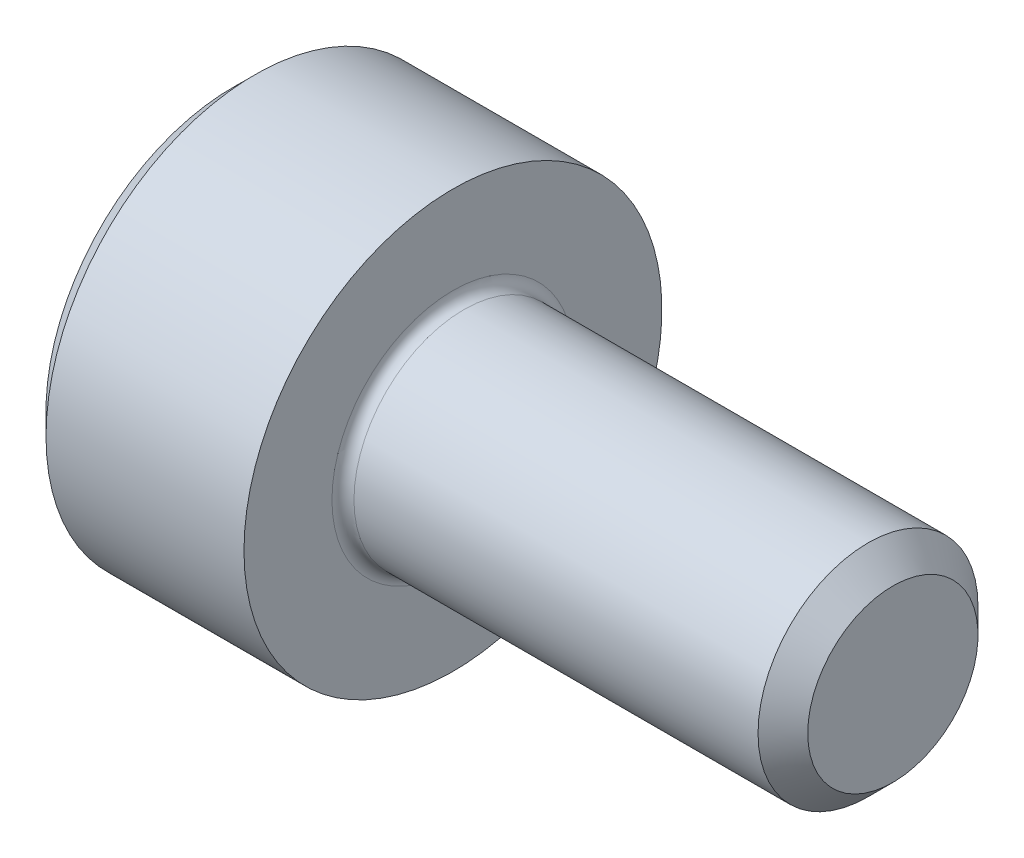
ISO-10303-21;
HEADER;
FILE_DESCRIPTION(('STEP AP214'),'2;1');
FILE_NAME('part.step','',(''),(''),'','','');
FILE_SCHEMA(('AUTOMOTIVE_DESIGN { 1 0 10303 214 1 1 1 1 }'));
ENDSEC;
DATA;
#1=APPLICATION_CONTEXT('core data for automotive mechanical design processes');
#2=APPLICATION_PROTOCOL_DEFINITION('international standard','automotive_design',2000,#1);
#3=PRODUCT_CONTEXT('',#1,'mechanical');
#4=PRODUCT('Part','Part','',(#3));
#5=PRODUCT_RELATED_PRODUCT_CATEGORY('part','',(#4));
#6=PRODUCT_DEFINITION_FORMATION('','',#4);
#7=PRODUCT_DEFINITION_CONTEXT('part definition',#1,'design');
#8=PRODUCT_DEFINITION('design','',#6,#7);
#9=PRODUCT_DEFINITION_SHAPE('','',#8);
#10=(LENGTH_UNIT() NAMED_UNIT(*) SI_UNIT(.MILLI.,.METRE.));
#11=(NAMED_UNIT(*) PLANE_ANGLE_UNIT() SI_UNIT($,.RADIAN.));
#12=(NAMED_UNIT(*) SI_UNIT($,.STERADIAN.) SOLID_ANGLE_UNIT());
#13=UNCERTAINTY_MEASURE_WITH_UNIT(LENGTH_MEASURE(1.E-05),#10,'distance_accuracy_value','');
#14=(GEOMETRIC_REPRESENTATION_CONTEXT(3) GLOBAL_UNCERTAINTY_ASSIGNED_CONTEXT((#13)) GLOBAL_UNIT_ASSIGNED_CONTEXT((#10,
#11,#12)) REPRESENTATION_CONTEXT('',''));
#15=CARTESIAN_POINT('',(0.,0.,0.));
#16=DIRECTION('',(0.,0.,1.));
#17=DIRECTION('',(1.,0.,0.));
#18=AXIS2_PLACEMENT_3D('',#15,#16,#17);
#19=CARTESIAN_POINT('',(0.999999999976353,0.,0.));
#20=DIRECTION('',(-1.,0.,0.));
#21=DIRECTION('',(0.,0.,1.));
#22=AXIS2_PLACEMENT_3D('',#19,#20,#21);
#23=CONICAL_SURFACE('',#22,0.772500000039145,1.04719755119766);
#24=CARTESIAN_POINT('',(1.44600308291842,0.,2.8421709430404E-11));
#25=VERTEX_POINT('',#24);
#26=VERTEX_LOOP('',#25);
#27=FACE_BOUND('',#26,.T.);
#28=CARTESIAN_POINT('',(0.999999999976353,0.,0.));
#29=DIRECTION('',(-1.,0.,0.));
#30=DIRECTION('',(0.,0.,1.));
#31=AXIS2_PLACEMENT_3D('',#28,#29,#30);
#32=CIRCLE('',#31,0.772500000039145);
#33=CARTESIAN_POINT('',(0.999999999988177,-0.669004624440429,0.386250000009787));
#34=VERTEX_POINT('',#33);
#35=CARTESIAN_POINT('',(0.999999999988177,0.,0.772500000019571));
#36=VERTEX_POINT('',#35);
#37=EDGE_CURVE('E96',#34,#36,#32,.T.);
#38=ORIENTED_EDGE('',*,*,#37,.T.);
#39=CARTESIAN_POINT('',(0.999999999976353,0.,0.));
#40=DIRECTION('',(-1.,0.,0.));
#41=DIRECTION('',(0.,0.,1.));
#42=AXIS2_PLACEMENT_3D('',#39,#40,#41);
#43=CIRCLE('',#42,0.772500000039145);
#44=CARTESIAN_POINT('',(0.999999999988177,0.669004624440428,0.386250000009784));
#45=VERTEX_POINT('',#44);
#46=EDGE_CURVE('E99',#36,#45,#43,.T.);
#47=ORIENTED_EDGE('',*,*,#46,.T.);
#48=CARTESIAN_POINT('',(0.999999999976353,0.,0.));
#49=DIRECTION('',(-1.,0.,0.));
#50=DIRECTION('',(0.,0.,1.));
#51=AXIS2_PLACEMENT_3D('',#48,#49,#50);
#52=CIRCLE('',#51,0.772500000039145);
#53=CARTESIAN_POINT('',(0.999999999988177,0.669004624440428,-0.386250000009787));
#54=VERTEX_POINT('',#53);
#55=EDGE_CURVE('E101',#45,#54,#52,.T.);
#56=ORIENTED_EDGE('',*,*,#55,.T.);
#57=CARTESIAN_POINT('',(0.999999999976353,0.,0.));
#58=DIRECTION('',(-1.,0.,0.));
#59=DIRECTION('',(0.,0.,1.));
#60=AXIS2_PLACEMENT_3D('',#57,#58,#59);
#61=CIRCLE('',#60,0.772500000039145);
#62=CARTESIAN_POINT('',(0.999999999988177,0.,-0.772500000019573));
#63=VERTEX_POINT('',#62);
#64=EDGE_CURVE('E115',#54,#63,#61,.T.);
#65=ORIENTED_EDGE('',*,*,#64,.T.);
#66=CARTESIAN_POINT('',(0.999999999976353,0.,0.));
#67=DIRECTION('',(-1.,0.,0.));
#68=DIRECTION('',(0.,0.,1.));
#69=AXIS2_PLACEMENT_3D('',#66,#67,#68);
#70=CIRCLE('',#69,0.772500000039145);
#71=CARTESIAN_POINT('',(0.999999999988177,-0.669004624440431,-0.386250000009786));
#72=VERTEX_POINT('',#71);
#73=EDGE_CURVE('E116',#63,#72,#70,.T.);
#74=ORIENTED_EDGE('',*,*,#73,.T.);
#75=CARTESIAN_POINT('',(0.999999999976353,0.,0.));
#76=DIRECTION('',(-1.,0.,0.));
#77=DIRECTION('',(0.,0.,1.));
#78=AXIS2_PLACEMENT_3D('',#75,#76,#77);
#79=CIRCLE('',#78,0.772500000039145);
#80=EDGE_CURVE('E226',#72,#34,#79,.T.);
#81=ORIENTED_EDGE('',*,*,#80,.T.);
#82=EDGE_LOOP('',(#38,#47,#56,#65,#74,#81));
#83=FACE_BOUND('',#82,.T.);
#84=ADVANCED_FACE('F17',(#27,#83),#23,.F.);
#85=CARTESIAN_POINT('',(1.,1.33800924884695,-0.772500000000004));
#86=DIRECTION('',(1.,0.,0.));
#87=DIRECTION('',(0.,0.,-1.));
#88=AXIS2_PLACEMENT_3D('',#85,#86,#87);
#89=PLANE('',#88);
#90=DIRECTION('',(0.,0.499999999999999,-0.866025403784439));
#91=VECTOR('',#90,1.);
#92=CARTESIAN_POINT('',(1.,0.892006165897968,0.));
#93=LINE('',#92,#91);
#94=CARTESIAN_POINT('',(1.,0.446003082948984,0.772499999999998));
#95=VERTEX_POINT('',#94);
#96=EDGE_CURVE('E119',#45,#95,#93,.F.);
#97=ORIENTED_EDGE('',*,*,#96,.F.);
#98=ORIENTED_EDGE('',*,*,#46,.F.);
#99=DIRECTION('',(0.,-1.,0.));
#100=VECTOR('',#99,1.);
#101=CARTESIAN_POINT('',(1.,-0.446003082948988,0.772499999999999));
#102=LINE('',#101,#100);
#103=EDGE_CURVE('E121',#36,#95,#102,.F.);
#104=ORIENTED_EDGE('',*,*,#103,.T.);
#105=EDGE_LOOP('',(#97,#98,#104));
#106=FACE_BOUND('',#105,.T.);
#107=ADVANCED_FACE('F120',(#106),#89,.F.);
#108=CARTESIAN_POINT('',(1.,1.33800924884695,-0.772500000000004));
#109=DIRECTION('',(1.,0.,0.));
#110=DIRECTION('',(0.,0.,-1.));
#111=AXIS2_PLACEMENT_3D('',#108,#109,#110);
#112=PLANE('',#111);
#113=DIRECTION('',(0.,-1.,0.));
#114=VECTOR('',#113,1.);
#115=CARTESIAN_POINT('',(1.,-0.446003082948988,0.772499999999999));
#116=LINE('',#115,#114);
#117=CARTESIAN_POINT('',(1.,-0.446003082948988,0.772499999999999));
#118=VERTEX_POINT('',#117);
#119=EDGE_CURVE('E124',#118,#36,#116,.F.);
#120=ORIENTED_EDGE('',*,*,#119,.T.);
#121=ORIENTED_EDGE('',*,*,#37,.F.);
#122=DIRECTION('',(0.,0.500000000000001,0.866025403784438));
#123=VECTOR('',#122,1.);
#124=CARTESIAN_POINT('',(1.,-0.446003082948988,0.772499999999999));
#125=LINE('',#124,#123);
#126=EDGE_CURVE('E177',#118,#34,#125,.F.);
#127=ORIENTED_EDGE('',*,*,#126,.F.);
#128=EDGE_LOOP('',(#120,#121,#127));
#129=FACE_BOUND('',#128,.T.);
#130=ADVANCED_FACE('F346',(#129),#112,.F.);
#131=CARTESIAN_POINT('',(1.,1.33800924884695,-0.772500000000004));
#132=DIRECTION('',(1.,0.,0.));
#133=DIRECTION('',(0.,0.,-1.));
#134=AXIS2_PLACEMENT_3D('',#131,#132,#133);
#135=PLANE('',#134);
#136=DIRECTION('',(0.,0.500000000000001,0.866025403784438));
#137=VECTOR('',#136,1.);
#138=CARTESIAN_POINT('',(1.,-0.446003082948988,0.772499999999999));
#139=LINE('',#138,#137);
#140=CARTESIAN_POINT('',(1.,-0.892006165897975,0.));
#141=VERTEX_POINT('',#140);
#142=EDGE_CURVE('E173',#34,#141,#139,.F.);
#143=ORIENTED_EDGE('',*,*,#142,.F.);
#144=ORIENTED_EDGE('',*,*,#80,.F.);
#145=DIRECTION('',(0.,-0.499999999999999,0.86602540378444));
#146=VECTOR('',#145,1.);
#147=CARTESIAN_POINT('',(1.,-0.892006165897975,0.));
#148=LINE('',#147,#146);
#149=EDGE_CURVE('E160',#141,#72,#148,.F.);
#150=ORIENTED_EDGE('',*,*,#149,.F.);
#151=EDGE_LOOP('',(#143,#144,#150));
#152=FACE_BOUND('',#151,.T.);
#153=ADVANCED_FACE('F342',(#152),#135,.F.);
#154=CARTESIAN_POINT('',(1.,1.33800924884695,-0.772500000000004));
#155=DIRECTION('',(1.,0.,0.));
#156=DIRECTION('',(0.,0.,-1.));
#157=AXIS2_PLACEMENT_3D('',#154,#155,#156);
#158=PLANE('',#157);
#159=DIRECTION('',(0.,-0.499999999999999,0.86602540378444));
#160=VECTOR('',#159,1.);
#161=CARTESIAN_POINT('',(1.,-0.892006165897975,0.));
#162=LINE('',#161,#160);
#163=CARTESIAN_POINT('',(1.,-0.44600308294899,-0.772500000000002));
#164=VERTEX_POINT('',#163);
#165=EDGE_CURVE('E157',#72,#164,#162,.F.);
#166=ORIENTED_EDGE('',*,*,#165,.F.);
#167=ORIENTED_EDGE('',*,*,#73,.F.);
#168=DIRECTION('',(0.,1.,0.));
#169=VECTOR('',#168,1.);
#170=CARTESIAN_POINT('',(1.,0.446003082948981,-0.772500000000003));
#171=LINE('',#170,#169);
#172=EDGE_CURVE('E151',#63,#164,#171,.F.);
#173=ORIENTED_EDGE('',*,*,#172,.T.);
#174=EDGE_LOOP('',(#166,#167,#173));
#175=FACE_BOUND('',#174,.T.);
#176=ADVANCED_FACE('F339',(#175),#158,.F.);
#177=CARTESIAN_POINT('',(1.,1.33800924884695,-0.772500000000004));
#178=DIRECTION('',(1.,0.,0.));
#179=DIRECTION('',(0.,0.,-1.));
#180=AXIS2_PLACEMENT_3D('',#177,#178,#179);
#181=PLANE('',#180);
#182=DIRECTION('',(0.,0.500000000000001,0.866025403784438));
#183=VECTOR('',#182,1.);
#184=CARTESIAN_POINT('',(1.,0.892006165897968,0.));
#185=LINE('',#184,#183);
#186=CARTESIAN_POINT('',(1.,0.892006165897968,0.));
#187=VERTEX_POINT('',#186);
#188=EDGE_CURVE('E113',#187,#54,#185,.F.);
#189=ORIENTED_EDGE('',*,*,#188,.T.);
#190=ORIENTED_EDGE('',*,*,#55,.F.);
#191=DIRECTION('',(0.,0.499999999999999,-0.866025403784439));
#192=VECTOR('',#191,1.);
#193=CARTESIAN_POINT('',(1.,0.892006165897968,0.));
#194=LINE('',#193,#192);
#195=EDGE_CURVE('E110',#187,#45,#194,.F.);
#196=ORIENTED_EDGE('',*,*,#195,.F.);
#197=EDGE_LOOP('',(#189,#190,#196));
#198=FACE_BOUND('',#197,.T.);
#199=ADVANCED_FACE('F108',(#198),#181,.F.);
#200=CARTESIAN_POINT('',(1.,1.33800924884695,-0.772500000000004));
#201=DIRECTION('',(1.,0.,0.));
#202=DIRECTION('',(0.,0.,-1.));
#203=AXIS2_PLACEMENT_3D('',#200,#201,#202);
#204=PLANE('',#203);
#205=DIRECTION('',(0.,1.,0.));
#206=VECTOR('',#205,1.);
#207=CARTESIAN_POINT('',(1.,0.446003082948981,-0.772500000000003));
#208=LINE('',#207,#206);
#209=CARTESIAN_POINT('',(1.,0.446003082948982,-0.772500000000003));
#210=VERTEX_POINT('',#209);
#211=EDGE_CURVE('E154',#210,#63,#208,.F.);
#212=ORIENTED_EDGE('',*,*,#211,.T.);
#213=ORIENTED_EDGE('',*,*,#64,.F.);
#214=DIRECTION('',(0.,0.500000000000001,0.866025403784438));
#215=VECTOR('',#214,1.);
#216=CARTESIAN_POINT('',(1.,0.892006165897968,0.));
#217=LINE('',#216,#215);
#218=EDGE_CURVE('E499',#54,#210,#217,.F.);
#219=ORIENTED_EDGE('',*,*,#218,.T.);
#220=EDGE_LOOP('',(#212,#213,#219));
#221=FACE_BOUND('',#220,.T.);
#222=ADVANCED_FACE('F333',(#221),#204,.F.);
#223=CARTESIAN_POINT('',(1.,0.892006165897968,0.));
#224=DIRECTION('',(0.,-0.866025403784439,-0.499999999999999));
#225=DIRECTION('',(0.,0.499999999999999,-0.866025403784439));
#226=AXIS2_PLACEMENT_3D('',#223,#224,#225);
#227=PLANE('',#226);
#228=ORIENTED_EDGE('',*,*,#96,.T.);
#229=DIRECTION('',(1.,0.,0.));
#230=VECTOR('',#229,1.);
#231=CARTESIAN_POINT('',(1.,0.446003082948984,0.772499999999997));
#232=LINE('',#231,#230);
#233=CARTESIAN_POINT('',(0.,0.446003082948984,0.772499999999997));
#234=VERTEX_POINT('',#233);
#235=EDGE_CURVE('E197',#95,#234,#232,.F.);
#236=ORIENTED_EDGE('',*,*,#235,.T.);
#237=DIRECTION('',(0.,-0.499999999999999,0.86602540378444));
#238=VECTOR('',#237,1.);
#239=CARTESIAN_POINT('',(0.,0.892006165897968,0.));
#240=LINE('',#239,#238);
#241=CARTESIAN_POINT('',(0.,0.892006165897968,0.));
#242=VERTEX_POINT('',#241);
#243=EDGE_CURVE('E137',#242,#234,#240,.T.);
#244=ORIENTED_EDGE('',*,*,#243,.F.);
#245=DIRECTION('',(1.,0.,0.));
#246=VECTOR('',#245,1.);
#247=CARTESIAN_POINT('',(1.,0.892006165897968,0.));
#248=LINE('',#247,#246);
#249=EDGE_CURVE('E128',#242,#187,#248,.T.);
#250=ORIENTED_EDGE('',*,*,#249,.T.);
#251=ORIENTED_EDGE('',*,*,#195,.T.);
#252=EDGE_LOOP('',(#228,#236,#244,#250,#251));
#253=FACE_BOUND('',#252,.T.);
#254=ADVANCED_FACE('F126',(#253),#227,.T.);
#255=CARTESIAN_POINT('',(1.,-0.446003082948988,0.772499999999999));
#256=DIRECTION('',(0.,0.,1.));
#257=DIRECTION('',(0.,-1.,0.));
#258=AXIS2_PLACEMENT_3D('',#255,#256,#257);
#259=PLANE('',#258);
#260=ORIENTED_EDGE('',*,*,#235,.F.);
#261=ORIENTED_EDGE('',*,*,#103,.F.);
#262=ORIENTED_EDGE('',*,*,#119,.F.);
#263=DIRECTION('',(1.,0.,0.));
#264=VECTOR('',#263,1.);
#265=CARTESIAN_POINT('',(1.,-0.446003082948988,0.772499999999999));
#266=LINE('',#265,#264);
#267=CARTESIAN_POINT('',(0.,-0.446003082948988,0.772499999999998));
#268=VERTEX_POINT('',#267);
#269=EDGE_CURVE('E192',#268,#118,#266,.T.);
#270=ORIENTED_EDGE('',*,*,#269,.F.);
#271=DIRECTION('',(0.,1.,0.));
#272=VECTOR('',#271,1.);
#273=CARTESIAN_POINT('',(0.,0.,0.772499999999998));
#274=LINE('',#273,#272);
#275=EDGE_CURVE('E140',#234,#268,#274,.F.);
#276=ORIENTED_EDGE('',*,*,#275,.F.);
#277=EDGE_LOOP('',(#260,#261,#262,#270,#276));
#278=FACE_BOUND('',#277,.T.);
#279=ADVANCED_FACE('F326',(#278),#259,.F.);
#280=CARTESIAN_POINT('',(1.,-0.446003082948988,0.772499999999999));
#281=DIRECTION('',(0.,0.866025403784438,-0.500000000000001));
#282=DIRECTION('',(0.,0.500000000000001,0.866025403784438));
#283=AXIS2_PLACEMENT_3D('',#280,#281,#282);
#284=PLANE('',#283);
#285=ORIENTED_EDGE('',*,*,#142,.T.);
#286=DIRECTION('',(1.,0.,0.));
#287=VECTOR('',#286,1.);
#288=CARTESIAN_POINT('',(1.,-0.892006165897975,0.));
#289=LINE('',#288,#287);
#290=CARTESIAN_POINT('',(0.,-0.892006165897975,0.));
#291=VERTEX_POINT('',#290);
#292=EDGE_CURVE('E168',#291,#141,#289,.T.);
#293=ORIENTED_EDGE('',*,*,#292,.F.);
#294=DIRECTION('',(0.,-0.500000000000001,-0.866025403784438));
#295=VECTOR('',#294,1.);
#296=CARTESIAN_POINT('',(0.,-0.446003082948988,0.772499999999999));
#297=LINE('',#296,#295);
#298=EDGE_CURVE('E183',#268,#291,#297,.T.);
#299=ORIENTED_EDGE('',*,*,#298,.F.);
#300=ORIENTED_EDGE('',*,*,#269,.T.);
#301=ORIENTED_EDGE('',*,*,#126,.T.);
#302=EDGE_LOOP('',(#285,#293,#299,#300,#301));
#303=FACE_BOUND('',#302,.T.);
#304=ADVANCED_FACE('F322',(#303),#284,.T.);
#305=CARTESIAN_POINT('',(1.,-0.892006165897975,0.));
#306=DIRECTION('',(0.,0.86602540378444,0.499999999999999));
#307=DIRECTION('',(0.,-0.499999999999999,0.86602540378444));
#308=AXIS2_PLACEMENT_3D('',#305,#306,#307);
#309=PLANE('',#308);
#310=ORIENTED_EDGE('',*,*,#165,.T.);
#311=DIRECTION('',(1.,0.,0.));
#312=VECTOR('',#311,1.);
#313=CARTESIAN_POINT('',(1.,-0.44600308294899,-0.772500000000002));
#314=LINE('',#313,#312);
#315=CARTESIAN_POINT('',(0.,-0.44600308294899,-0.772500000000001));
#316=VERTEX_POINT('',#315);
#317=EDGE_CURVE('E153',#164,#316,#314,.F.);
#318=ORIENTED_EDGE('',*,*,#317,.T.);
#319=DIRECTION('',(0.,0.499999999999999,-0.86602540378444));
#320=VECTOR('',#319,1.);
#321=CARTESIAN_POINT('',(0.,-0.892006165897975,0.));
#322=LINE('',#321,#320);
#323=EDGE_CURVE('E180',#291,#316,#322,.T.);
#324=ORIENTED_EDGE('',*,*,#323,.F.);
#325=ORIENTED_EDGE('',*,*,#292,.T.);
#326=ORIENTED_EDGE('',*,*,#149,.T.);
#327=EDGE_LOOP('',(#310,#318,#324,#325,#326));
#328=FACE_BOUND('',#327,.T.);
#329=ADVANCED_FACE('F318',(#328),#309,.T.);
#330=CARTESIAN_POINT('',(1.,0.446003082948981,-0.772500000000003));
#331=DIRECTION('',(0.,0.,-1.));
#332=DIRECTION('',(0.,1.,0.));
#333=AXIS2_PLACEMENT_3D('',#330,#331,#332);
#334=PLANE('',#333);
#335=ORIENTED_EDGE('',*,*,#317,.F.);
#336=ORIENTED_EDGE('',*,*,#172,.F.);
#337=ORIENTED_EDGE('',*,*,#211,.F.);
#338=DIRECTION('',(1.,0.,0.));
#339=VECTOR('',#338,1.);
#340=CARTESIAN_POINT('',(1.,0.446003082948981,-0.772500000000003));
#341=LINE('',#340,#339);
#342=CARTESIAN_POINT('',(0.,0.446003082948981,-0.772500000000002));
#343=VERTEX_POINT('',#342);
#344=EDGE_CURVE('E141',#210,#343,#341,.F.);
#345=ORIENTED_EDGE('',*,*,#344,.T.);
#346=DIRECTION('',(0.,1.,0.));
#347=VECTOR('',#346,1.);
#348=CARTESIAN_POINT('',(0.,0.,-0.772500000000002));
#349=LINE('',#348,#347);
#350=EDGE_CURVE('E148',#316,#343,#349,.T.);
#351=ORIENTED_EDGE('',*,*,#350,.F.);
#352=EDGE_LOOP('',(#335,#336,#337,#345,#351));
#353=FACE_BOUND('',#352,.T.);
#354=ADVANCED_FACE('F314',(#353),#334,.F.);
#355=CARTESIAN_POINT('',(1.,0.892006165897968,0.));
#356=DIRECTION('',(0.,0.866025403784438,-0.500000000000001));
#357=DIRECTION('',(0.,0.500000000000001,0.866025403784438));
#358=AXIS2_PLACEMENT_3D('',#355,#356,#357);
#359=PLANE('',#358);
#360=ORIENTED_EDGE('',*,*,#344,.F.);
#361=ORIENTED_EDGE('',*,*,#218,.F.);
#362=ORIENTED_EDGE('',*,*,#188,.F.);
#363=ORIENTED_EDGE('',*,*,#249,.F.);
#364=DIRECTION('',(0.,0.500000000000001,0.866025403784438));
#365=VECTOR('',#364,1.);
#366=CARTESIAN_POINT('',(0.,0.446003082948981,-0.772500000000003));
#367=LINE('',#366,#365);
#368=EDGE_CURVE('E144',#343,#242,#367,.T.);
#369=ORIENTED_EDGE('',*,*,#368,.F.);
#370=EDGE_LOOP('',(#360,#361,#362,#363,#369));
#371=FACE_BOUND('',#370,.T.);
#372=ADVANCED_FACE('F310',(#371),#359,.F.);
#373=CARTESIAN_POINT('',(0.,0.,0.));
#374=DIRECTION('',(-1.,0.,0.));
#375=DIRECTION('',(0.,0.,1.));
#376=AXIS2_PLACEMENT_3D('',#373,#374,#375);
#377=PLANE('',#376);
#378=CARTESIAN_POINT('',(0.,0.,0.));
#379=DIRECTION('',(1.,0.,0.));
#380=DIRECTION('',(0.,0.,-1.));
#381=AXIS2_PLACEMENT_3D('',#378,#379,#380);
#382=CIRCLE('',#381,1.70000000002801);
#383=CARTESIAN_POINT('',(0.,0.,-1.70000000002801));
#384=VERTEX_POINT('',#383);
#385=EDGE_CURVE('E147',#384,#384,#382,.T.);
#386=ORIENTED_EDGE('',*,*,#385,.F.);
#387=EDGE_LOOP('',(#386));
#388=FACE_BOUND('',#387,.T.);
#389=ORIENTED_EDGE('',*,*,#350,.T.);
#390=ORIENTED_EDGE('',*,*,#368,.T.);
#391=ORIENTED_EDGE('',*,*,#243,.T.);
#392=ORIENTED_EDGE('',*,*,#275,.T.);
#393=ORIENTED_EDGE('',*,*,#298,.T.);
#394=ORIENTED_EDGE('',*,*,#323,.T.);
#395=EDGE_LOOP('',(#389,#390,#391,#392,#393,#394));
#396=FACE_BOUND('',#395,.T.);
#397=ADVANCED_FACE('F302',(#388,#396),#377,.T.);
#398=CARTESIAN_POINT('',(0.200000000006639,0.,0.));
#399=DIRECTION('',(1.,0.,0.));
#400=DIRECTION('',(0.,0.,-1.));
#401=AXIS2_PLACEMENT_3D('',#398,#399,#400);
#402=CONICAL_SURFACE('',#401,1.90000000003465,0.785398163397448);
#403=ORIENTED_EDGE('',*,*,#385,.T.);
#404=EDGE_LOOP('',(#403));
#405=FACE_BOUND('',#404,.T.);
#406=CARTESIAN_POINT('',(0.199999999999999,0.,0.));
#407=DIRECTION('',(-1.,0.,0.));
#408=DIRECTION('',(0.,0.,1.));
#409=AXIS2_PLACEMENT_3D('',#406,#407,#408);
#410=CIRCLE('',#409,1.9);
#411=CARTESIAN_POINT('',(0.199999999999999,0.,1.9));
#412=VERTEX_POINT('',#411);
#413=EDGE_CURVE('E222',#412,#412,#410,.F.);
#414=ORIENTED_EDGE('',*,*,#413,.F.);
#415=EDGE_LOOP('',(#414));
#416=FACE_BOUND('',#415,.T.);
#417=ADVANCED_FACE('F297',(#405,#416),#402,.T.);
#418=CARTESIAN_POINT('',(-31.75,0.,0.));
#419=DIRECTION('',(-1.,0.,0.));
#420=DIRECTION('',(0.,0.,1.));
#421=AXIS2_PLACEMENT_3D('',#418,#419,#420);
#422=CYLINDRICAL_SURFACE('',#421,1.9);
#423=CARTESIAN_POINT('',(2.,0.,0.));
#424=DIRECTION('',(-1.,0.,0.));
#425=DIRECTION('',(0.,0.,1.));
#426=AXIS2_PLACEMENT_3D('',#423,#424,#425);
#427=CIRCLE('',#426,1.9);
#428=CARTESIAN_POINT('',(2.,0.,1.9));
#429=VERTEX_POINT('',#428);
#430=EDGE_CURVE('E219',#429,#429,#427,.F.);
#431=ORIENTED_EDGE('',*,*,#430,.F.);
#432=EDGE_LOOP('',(#431));
#433=FACE_BOUND('',#432,.T.);
#434=ORIENTED_EDGE('',*,*,#413,.T.);
#435=EDGE_LOOP('',(#434));
#436=FACE_BOUND('',#435,.T.);
#437=ADVANCED_FACE('F293',(#433,#436),#422,.T.);
#438=CARTESIAN_POINT('',(6.,0.774,0.));
#439=DIRECTION('',(1.,0.,0.));
#440=DIRECTION('',(0.,0.,-1.));
#441=AXIS2_PLACEMENT_3D('',#438,#439,#440);
#442=PLANE('',#441);
#443=CARTESIAN_POINT('',(5.99999999997181,0.,0.));
#444=DIRECTION('',(-1.,0.,0.));
#445=DIRECTION('',(0.,0.,1.));
#446=AXIS2_PLACEMENT_3D('',#443,#444,#445);
#447=CIRCLE('',#446,0.773999999921671);
#448=CARTESIAN_POINT('',(5.99999999997181,0.,0.773999999921671));
#449=VERTEX_POINT('',#448);
#450=EDGE_CURVE('E215',#449,#449,#447,.T.);
#451=ORIENTED_EDGE('',*,*,#450,.F.);
#452=EDGE_LOOP('',(#451));
#453=FACE_BOUND('',#452,.T.);
#454=ADVANCED_FACE('F251',(#453),#442,.T.);
#455=CARTESIAN_POINT('',(2.,1.9,0.));
#456=DIRECTION('',(1.,0.,0.));
#457=DIRECTION('',(0.,0.,-1.));
#458=AXIS2_PLACEMENT_3D('',#455,#456,#457);
#459=PLANE('',#458);
#460=ORIENTED_EDGE('',*,*,#430,.T.);
#461=EDGE_LOOP('',(#460));
#462=FACE_BOUND('',#461,.T.);
#463=CARTESIAN_POINT('',(2.,0.,0.));
#464=DIRECTION('',(1.,0.,0.));
#465=DIRECTION('',(0.,0.,1.));
#466=AXIS2_PLACEMENT_3D('',#463,#464,#465);
#467=CIRCLE('',#466,1.1);
#468=CARTESIAN_POINT('',(2.,0.,-1.1));
#469=VERTEX_POINT('',#468);
#470=CARTESIAN_POINT('',(2.,0.,1.1));
#471=VERTEX_POINT('',#470);
#472=EDGE_CURVE('E218',#469,#471,#467,.F.);
#473=ORIENTED_EDGE('',*,*,#472,.T.);
#474=CARTESIAN_POINT('',(2.,0.,0.));
#475=DIRECTION('',(1.,0.,0.));
#476=DIRECTION('',(0.,0.,-1.));
#477=AXIS2_PLACEMENT_3D('',#474,#475,#476);
#478=CIRCLE('',#477,1.1);
#479=EDGE_CURVE('E36',#471,#469,#478,.F.);
#480=ORIENTED_EDGE('',*,*,#479,.T.);
#481=EDGE_LOOP('',(#473,#480));
#482=FACE_BOUND('',#481,.T.);
#483=ADVANCED_FACE('F232',(#462,#482),#459,.T.);
#484=CARTESIAN_POINT('',(5.77400000003081,0.,0.));
#485=DIRECTION('',(-1.,0.,0.));
#486=DIRECTION('',(0.,0.,1.));
#487=AXIS2_PLACEMENT_3D('',#484,#485,#486);
#488=CONICAL_SURFACE('',#487,0.999999999862666,0.785398163397448);
#489=CARTESIAN_POINT('',(5.77400000000002,0.,0.));
#490=DIRECTION('',(-1.,0.,0.));
#491=DIRECTION('',(0.,0.,1.));
#492=AXIS2_PLACEMENT_3D('',#489,#490,#491);
#493=CIRCLE('',#492,1.);
#494=CARTESIAN_POINT('',(5.77400000000002,0.,1.));
#495=VERTEX_POINT('',#494);
#496=EDGE_CURVE('E28',#495,#495,#493,.T.);
#497=ORIENTED_EDGE('',*,*,#496,.F.);
#498=EDGE_LOOP('',(#497));
#499=FACE_BOUND('',#498,.T.);
#500=ORIENTED_EDGE('',*,*,#450,.T.);
#501=EDGE_LOOP('',(#500));
#502=FACE_BOUND('',#501,.T.);
#503=ADVANCED_FACE('F250',(#499,#502),#488,.T.);
#504=CARTESIAN_POINT('',(2.1,0.,0.));
#505=DIRECTION('',(1.,0.,0.));
#506=DIRECTION('',(0.,0.,-1.));
#507=AXIS2_PLACEMENT_3D('',#504,#505,#506);
#508=TOROIDAL_SURFACE('',#507,1.1,0.1);
#509=CARTESIAN_POINT('',(2.1,0.,0.));
#510=DIRECTION('',(-1.,0.,0.));
#511=DIRECTION('',(0.,0.,1.));
#512=AXIS2_PLACEMENT_3D('',#509,#510,#511);
#513=CIRCLE('',#512,1.);
#514=CARTESIAN_POINT('',(2.1,0.,1.));
#515=VERTEX_POINT('',#514);
#516=EDGE_CURVE('E11',#515,#515,#513,.F.);
#517=ORIENTED_EDGE('',*,*,#516,.F.);
#518=EDGE_LOOP('',(#517));
#519=FACE_BOUND('',#518,.T.);
#520=ORIENTED_EDGE('',*,*,#472,.F.);
#521=ORIENTED_EDGE('',*,*,#479,.F.);
#522=EDGE_LOOP('',(#520,#521));
#523=FACE_BOUND('',#522,.T.);
#524=ADVANCED_FACE('F229',(#519,#523),#508,.F.);
#525=CARTESIAN_POINT('',(-31.75,0.,0.));
#526=DIRECTION('',(-1.,0.,0.));
#527=DIRECTION('',(0.,0.,1.));
#528=AXIS2_PLACEMENT_3D('',#525,#526,#527);
#529=CYLINDRICAL_SURFACE('',#528,1.);
#530=ORIENTED_EDGE('',*,*,#516,.T.);
#531=EDGE_LOOP('',(#530));
#532=FACE_BOUND('',#531,.T.);
#533=ORIENTED_EDGE('',*,*,#496,.T.);
#534=EDGE_LOOP('',(#533));
#535=FACE_BOUND('',#534,.T.);
#536=ADVANCED_FACE('F275',(#532,#535),#529,.T.);
#537=CLOSED_SHELL('',(#84,#107,#130,#153,#176,#199,#222,#254,#279,#304,#329,#354,#372,#397,#417,
#437,#454,#483,#503,#524,#536));
#538=MANIFOLD_SOLID_BREP('B1',#537);
#539=ADVANCED_BREP_SHAPE_REPRESENTATION('',(#18,#538),#14);
#540=SHAPE_DEFINITION_REPRESENTATION(#9,#539);
ENDSEC;
END-ISO-10303-21;
